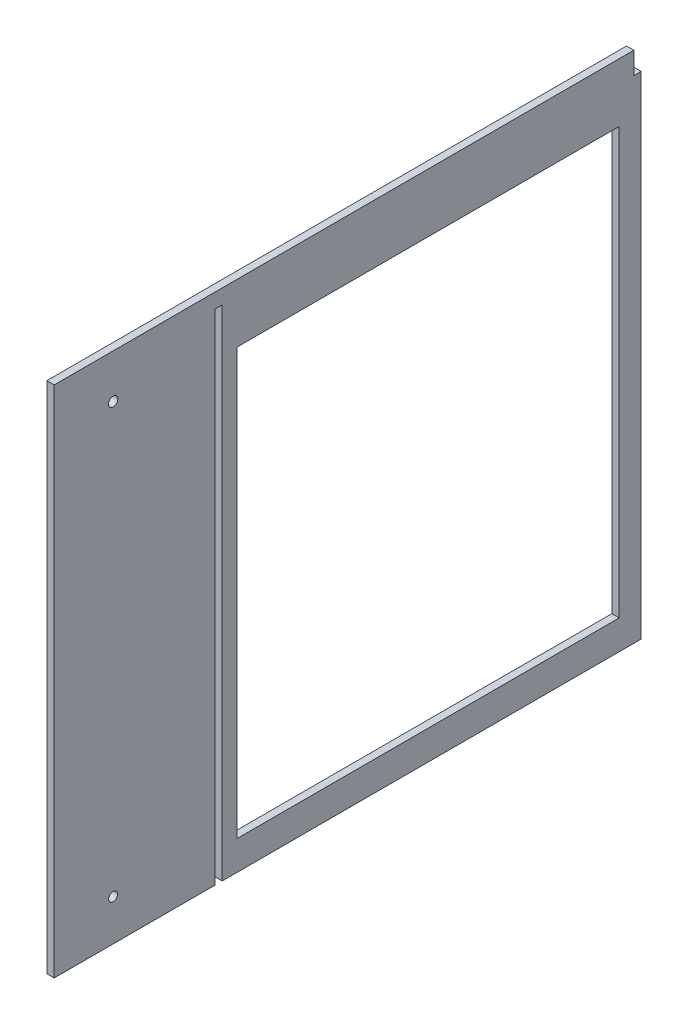
ISO-10303-21;
HEADER;
FILE_DESCRIPTION(('STEP AP214'),'2;1');
FILE_NAME('part.step','',(''),(''),'','','');
FILE_SCHEMA(('AUTOMOTIVE_DESIGN { 1 0 10303 214 1 1 1 1 }'));
ENDSEC;
DATA;
#1=APPLICATION_CONTEXT('core data for automotive mechanical design processes');
#2=APPLICATION_PROTOCOL_DEFINITION('international standard','automotive_design',2000,#1);
#3=PRODUCT_CONTEXT('',#1,'mechanical');
#4=PRODUCT('Part','Part','',(#3));
#5=PRODUCT_RELATED_PRODUCT_CATEGORY('part','',(#4));
#6=PRODUCT_DEFINITION_FORMATION('','',#4);
#7=PRODUCT_DEFINITION_CONTEXT('part definition',#1,'design');
#8=PRODUCT_DEFINITION('design','',#6,#7);
#9=PRODUCT_DEFINITION_SHAPE('','',#8);
#10=(LENGTH_UNIT() NAMED_UNIT(*) SI_UNIT(.MILLI.,.METRE.));
#11=(NAMED_UNIT(*) PLANE_ANGLE_UNIT() SI_UNIT($,.RADIAN.));
#12=(NAMED_UNIT(*) SI_UNIT($,.STERADIAN.) SOLID_ANGLE_UNIT());
#13=UNCERTAINTY_MEASURE_WITH_UNIT(LENGTH_MEASURE(1.E-05),#10,'distance_accuracy_value','');
#14=(GEOMETRIC_REPRESENTATION_CONTEXT(3) GLOBAL_UNCERTAINTY_ASSIGNED_CONTEXT((#13)) GLOBAL_UNIT_ASSIGNED_CONTEXT((#10,
#11,#12)) REPRESENTATION_CONTEXT('',''));
#15=CARTESIAN_POINT('',(0.,0.,0.));
#16=DIRECTION('',(0.,0.,1.));
#17=DIRECTION('',(1.,0.,0.));
#18=AXIS2_PLACEMENT_3D('',#15,#16,#17);
#19=CARTESIAN_POINT('',(-331.234660689463,-259.96015936255,-400.));
#20=DIRECTION('',(0.,-1.,0.));
#21=DIRECTION('',(0.,0.,-1.));
#22=AXIS2_PLACEMENT_3D('',#19,#20,#21);
#23=PLANE('',#22);
#24=DIRECTION('',(-1.,0.,0.));
#25=VECTOR('',#24,1.);
#26=CARTESIAN_POINT('',(-331.234660689463,-259.96015936255,-109.5));
#27=LINE('',#26,#25);
#28=CARTESIAN_POINT('',(-326.234660689463,-259.96015936255,-109.5));
#29=VERTEX_POINT('',#28);
#30=CARTESIAN_POINT('',(-331.234660689463,-259.96015936255,-109.5));
#31=VERTEX_POINT('',#30);
#32=EDGE_CURVE('E152',#29,#31,#27,.T.);
#33=ORIENTED_EDGE('',*,*,#32,.F.);
#34=DIRECTION('',(0.,0.,1.));
#35=VECTOR('',#34,1.);
#36=CARTESIAN_POINT('',(-326.234660689463,-259.96015936255,-400.));
#37=LINE('',#36,#35);
#38=CARTESIAN_POINT('',(-326.234660689463,-259.96015936255,0.));
#39=VERTEX_POINT('',#38);
#40=EDGE_CURVE('E224',#29,#39,#37,.T.);
#41=ORIENTED_EDGE('',*,*,#40,.T.);
#42=DIRECTION('',(1.,0.,0.));
#43=VECTOR('',#42,1.);
#44=CARTESIAN_POINT('',(-331.234660689463,-259.96015936255,0.));
#45=LINE('',#44,#43);
#46=CARTESIAN_POINT('',(-331.234660689463,-259.96015936255,0.));
#47=VERTEX_POINT('',#46);
#48=EDGE_CURVE('E208',#47,#39,#45,.T.);
#49=ORIENTED_EDGE('',*,*,#48,.F.);
#50=DIRECTION('',(0.,0.,1.));
#51=VECTOR('',#50,1.);
#52=CARTESIAN_POINT('',(-331.234660689463,-259.96015936255,-400.));
#53=LINE('',#52,#51);
#54=EDGE_CURVE('E205',#31,#47,#53,.T.);
#55=ORIENTED_EDGE('',*,*,#54,.F.);
#56=EDGE_LOOP('',(#33,#41,#49,#55));
#57=FACE_BOUND('',#56,.T.);
#58=ADVANCED_FACE('F32',(#57),#23,.T.);
#59=CARTESIAN_POINT('',(-331.234660689463,90.0398406374502,-400.));
#60=DIRECTION('',(-1.,0.,0.));
#61=DIRECTION('',(0.,0.,1.));
#62=AXIS2_PLACEMENT_3D('',#59,#60,#61);
#63=PLANE('',#62);
#64=CARTESIAN_POINT('',(-331.234660689463,60.1746951095763,-40.1848309699963));
#65=DIRECTION('',(-1.,0.,0.));
#66=DIRECTION('',(0.,0.,1.));
#67=AXIS2_PLACEMENT_3D('',#64,#65,#66);
#68=CIRCLE('',#67,3.175);
#69=CARTESIAN_POINT('',(-331.234660689463,60.1746951095763,-37.0098309699963));
#70=VERTEX_POINT('',#69);
#71=EDGE_CURVE('E242',#70,#70,#68,.T.);
#72=ORIENTED_EDGE('',*,*,#71,.F.);
#73=EDGE_LOOP('',(#72));
#74=FACE_BOUND('',#73,.T.);
#75=CARTESIAN_POINT('',(-331.234660689463,-232.01015936255,-40.1848309699963));
#76=DIRECTION('',(-1.,0.,0.));
#77=DIRECTION('',(0.,0.,1.));
#78=AXIS2_PLACEMENT_3D('',#75,#76,#77);
#79=CIRCLE('',#78,3.05);
#80=CARTESIAN_POINT('',(-331.234660689463,-232.01015936255,-37.1348309699963));
#81=VERTEX_POINT('',#80);
#82=EDGE_CURVE('E247',#81,#81,#79,.T.);
#83=ORIENTED_EDGE('',*,*,#82,.F.);
#84=EDGE_LOOP('',(#83));
#85=FACE_BOUND('',#84,.T.);
#86=DIRECTION('',(0.,1.,0.));
#87=VECTOR('',#86,1.);
#88=CARTESIAN_POINT('',(-331.234660689463,-259.96015936255,-109.5));
#89=LINE('',#88,#87);
#90=CARTESIAN_POINT('',(-331.234660689463,80.0398406374502,-109.5));
#91=VERTEX_POINT('',#90);
#92=EDGE_CURVE('E149',#31,#91,#89,.T.);
#93=ORIENTED_EDGE('',*,*,#92,.F.);
#94=ORIENTED_EDGE('',*,*,#54,.T.);
#95=DIRECTION('',(0.,-1.,0.));
#96=VECTOR('',#95,1.);
#97=CARTESIAN_POINT('',(-331.234660689463,90.0398406374502,0.));
#98=LINE('',#97,#96);
#99=CARTESIAN_POINT('',(-331.234660689463,90.0398406374502,0.));
#100=VERTEX_POINT('',#99);
#101=EDGE_CURVE('E195',#100,#47,#98,.T.);
#102=ORIENTED_EDGE('',*,*,#101,.F.);
#103=DIRECTION('',(0.,0.,1.));
#104=VECTOR('',#103,1.);
#105=CARTESIAN_POINT('',(-331.234660689463,90.0398406374502,-400.));
#106=LINE('',#105,#104);
#107=CARTESIAN_POINT('',(-331.234660689463,90.0398406374502,-395.));
#108=VERTEX_POINT('',#107);
#109=EDGE_CURVE('E216',#108,#100,#106,.T.);
#110=ORIENTED_EDGE('',*,*,#109,.F.);
#111=DIRECTION('',(0.,1.,0.));
#112=VECTOR('',#111,1.);
#113=CARTESIAN_POINT('',(-331.234660689463,90.0398406374502,-395.));
#114=LINE('',#113,#112);
#115=CARTESIAN_POINT('',(-331.234660689463,75.0398406374502,-395.));
#116=VERTEX_POINT('',#115);
#117=EDGE_CURVE('E184',#116,#108,#114,.T.);
#118=ORIENTED_EDGE('',*,*,#117,.F.);
#119=DIRECTION('',(0.,0.,1.));
#120=VECTOR('',#119,1.);
#121=CARTESIAN_POINT('',(-331.234660689463,75.0398406374502,-400.));
#122=LINE('',#121,#120);
#123=CARTESIAN_POINT('',(-331.234660689463,75.0398406374502,-400.));
#124=VERTEX_POINT('',#123);
#125=EDGE_CURVE('E181',#124,#116,#122,.T.);
#126=ORIENTED_EDGE('',*,*,#125,.F.);
#127=DIRECTION('',(0.,-1.,0.));
#128=VECTOR('',#127,1.);
#129=CARTESIAN_POINT('',(-331.234660689463,90.0398406374502,-400.));
#130=LINE('',#129,#128);
#131=CARTESIAN_POINT('',(-331.234660689463,-259.96015936255,-400.));
#132=VERTEX_POINT('',#131);
#133=EDGE_CURVE('E196',#124,#132,#130,.T.);
#134=ORIENTED_EDGE('',*,*,#133,.T.);
#135=CARTESIAN_POINT('',(-331.234660689463,-259.96015936255,-114.5));
#136=VERTEX_POINT('',#135);
#137=EDGE_CURVE('E225',#132,#136,#53,.T.);
#138=ORIENTED_EDGE('',*,*,#137,.T.);
#139=DIRECTION('',(0.,-1.,0.));
#140=VECTOR('',#139,1.);
#141=CARTESIAN_POINT('',(-331.234660689463,-259.96015936255,-114.5));
#142=LINE('',#141,#140);
#143=CARTESIAN_POINT('',(-331.234660689463,80.0398406374502,-114.5));
#144=VERTEX_POINT('',#143);
#145=EDGE_CURVE('E146',#144,#136,#142,.T.);
#146=ORIENTED_EDGE('',*,*,#145,.F.);
#147=DIRECTION('',(0.,0.,-1.));
#148=VECTOR('',#147,1.);
#149=CARTESIAN_POINT('',(-331.234660689463,80.0398406374502,-109.5));
#150=LINE('',#149,#148);
#151=EDGE_CURVE('E140',#91,#144,#150,.T.);
#152=ORIENTED_EDGE('',*,*,#151,.F.);
#153=EDGE_LOOP('',(#93,#94,#102,#110,#118,#126,#134,#138,#146,#152));
#154=FACE_BOUND('',#153,.T.);
#155=DIRECTION('',(0.,1.,0.));
#156=VECTOR('',#155,1.);
#157=CARTESIAN_POINT('',(-331.234660689463,-239.96015936255,-124.5));
#158=LINE('',#157,#156);
#159=CARTESIAN_POINT('',(-331.234660689463,-239.96015936255,-124.5));
#160=VERTEX_POINT('',#159);
#161=CARTESIAN_POINT('',(-331.234660689463,50.0398406374502,-124.5));
#162=VERTEX_POINT('',#161);
#163=EDGE_CURVE('E49',#160,#162,#158,.T.);
#164=ORIENTED_EDGE('',*,*,#163,.F.);
#165=DIRECTION('',(0.,0.,1.));
#166=VECTOR('',#165,1.);
#167=CARTESIAN_POINT('',(-331.234660689463,-239.96015936255,-124.5));
#168=LINE('',#167,#166);
#169=CARTESIAN_POINT('',(-331.234660689463,-239.96015936255,-385.));
#170=VERTEX_POINT('',#169);
#171=EDGE_CURVE('E172',#170,#160,#168,.T.);
#172=ORIENTED_EDGE('',*,*,#171,.F.);
#173=DIRECTION('',(0.,-1.,0.));
#174=VECTOR('',#173,1.);
#175=CARTESIAN_POINT('',(-331.234660689463,-239.96015936255,-385.));
#176=LINE('',#175,#174);
#177=CARTESIAN_POINT('',(-331.234660689463,50.0398406374501,-385.));
#178=VERTEX_POINT('',#177);
#179=EDGE_CURVE('E169',#178,#170,#176,.T.);
#180=ORIENTED_EDGE('',*,*,#179,.F.);
#181=DIRECTION('',(0.,0.,-1.));
#182=VECTOR('',#181,1.);
#183=CARTESIAN_POINT('',(-331.234660689463,50.0398406374502,-124.5));
#184=LINE('',#183,#182);
#185=EDGE_CURVE('E166',#162,#178,#184,.T.);
#186=ORIENTED_EDGE('',*,*,#185,.F.);
#187=EDGE_LOOP('',(#164,#172,#180,#186));
#188=FACE_BOUND('',#187,.T.);
#189=ADVANCED_FACE('F34',(#74,#85,#154,#188),#63,.T.);
#190=CARTESIAN_POINT('',(-331.234660689463,90.0398406374502,-400.));
#191=DIRECTION('',(0.,1.,0.));
#192=DIRECTION('',(0.,0.,1.));
#193=AXIS2_PLACEMENT_3D('',#190,#191,#192);
#194=PLANE('',#193);
#195=DIRECTION('',(-1.,0.,0.));
#196=VECTOR('',#195,1.);
#197=CARTESIAN_POINT('',(-301.234660689463,90.0398406374502,-395.));
#198=LINE('',#197,#196);
#199=CARTESIAN_POINT('',(-326.234660689463,90.0398406374502,-395.));
#200=VERTEX_POINT('',#199);
#201=EDGE_CURVE('E167',#200,#108,#198,.T.);
#202=ORIENTED_EDGE('',*,*,#201,.T.);
#203=ORIENTED_EDGE('',*,*,#109,.T.);
#204=DIRECTION('',(-1.,0.,0.));
#205=VECTOR('',#204,1.);
#206=CARTESIAN_POINT('',(-331.234660689463,90.0398406374502,0.));
#207=LINE('',#206,#205);
#208=CARTESIAN_POINT('',(-326.234660689463,90.0398406374502,0.));
#209=VERTEX_POINT('',#208);
#210=EDGE_CURVE('E199',#209,#100,#207,.T.);
#211=ORIENTED_EDGE('',*,*,#210,.F.);
#212=DIRECTION('',(0.,0.,1.));
#213=VECTOR('',#212,1.);
#214=CARTESIAN_POINT('',(-326.234660689463,90.0398406374502,-400.));
#215=LINE('',#214,#213);
#216=EDGE_CURVE('E219',#200,#209,#215,.T.);
#217=ORIENTED_EDGE('',*,*,#216,.F.);
#218=EDGE_LOOP('',(#202,#203,#211,#217));
#219=FACE_BOUND('',#218,.T.);
#220=ADVANCED_FACE('F257',(#219),#194,.T.);
#221=CARTESIAN_POINT('',(-326.234660689463,90.0398406374502,-400.));
#222=DIRECTION('',(1.,0.,0.));
#223=DIRECTION('',(0.,1.,0.));
#224=AXIS2_PLACEMENT_3D('',#221,#222,#223);
#225=PLANE('',#224);
#226=CARTESIAN_POINT('',(-326.234660689463,60.1746951095763,-40.1848309699963));
#227=DIRECTION('',(1.,0.,0.));
#228=DIRECTION('',(0.,1.,0.));
#229=AXIS2_PLACEMENT_3D('',#226,#227,#228);
#230=CIRCLE('',#229,3.175);
#231=CARTESIAN_POINT('',(-326.234660689463,63.3496951095763,-40.1848309699963));
#232=VERTEX_POINT('',#231);
#233=EDGE_CURVE('E36',#232,#232,#230,.T.);
#234=ORIENTED_EDGE('',*,*,#233,.F.);
#235=EDGE_LOOP('',(#234));
#236=FACE_BOUND('',#235,.T.);
#237=CARTESIAN_POINT('',(-326.234660689463,-232.01015936255,-40.1848309699963));
#238=DIRECTION('',(1.,0.,0.));
#239=DIRECTION('',(0.,1.,0.));
#240=AXIS2_PLACEMENT_3D('',#237,#238,#239);
#241=CIRCLE('',#240,3.05);
#242=CARTESIAN_POINT('',(-326.234660689463,-228.96015936255,-40.1848309699963));
#243=VERTEX_POINT('',#242);
#244=EDGE_CURVE('E240',#243,#243,#241,.T.);
#245=ORIENTED_EDGE('',*,*,#244,.F.);
#246=EDGE_LOOP('',(#245));
#247=FACE_BOUND('',#246,.T.);
#248=DIRECTION('',(0.,-1.,0.));
#249=VECTOR('',#248,1.);
#250=CARTESIAN_POINT('',(-326.234660689463,90.0398406374502,-109.5));
#251=LINE('',#250,#249);
#252=CARTESIAN_POINT('',(-326.234660689463,80.0398406374502,-109.5));
#253=VERTEX_POINT('',#252);
#254=EDGE_CURVE('E193',#253,#29,#251,.T.);
#255=ORIENTED_EDGE('',*,*,#254,.F.);
#256=DIRECTION('',(0.,0.,1.));
#257=VECTOR('',#256,1.);
#258=CARTESIAN_POINT('',(-326.234660689463,80.039840637451,-400.));
#259=LINE('',#258,#257);
#260=CARTESIAN_POINT('',(-326.234660689463,80.0398406374502,-114.5));
#261=VERTEX_POINT('',#260);
#262=EDGE_CURVE('E11',#261,#253,#259,.T.);
#263=ORIENTED_EDGE('',*,*,#262,.F.);
#264=DIRECTION('',(0.,1.,0.));
#265=VECTOR('',#264,1.);
#266=CARTESIAN_POINT('',(-326.234660689463,90.0398406374502,-114.5));
#267=LINE('',#266,#265);
#268=CARTESIAN_POINT('',(-326.234660689463,-259.96015936255,-114.5));
#269=VERTEX_POINT('',#268);
#270=EDGE_CURVE('E191',#269,#261,#267,.T.);
#271=ORIENTED_EDGE('',*,*,#270,.F.);
#272=CARTESIAN_POINT('',(-326.234660689463,-259.96015936255,-400.));
#273=VERTEX_POINT('',#272);
#274=EDGE_CURVE('E221',#273,#269,#37,.T.);
#275=ORIENTED_EDGE('',*,*,#274,.F.);
#276=DIRECTION('',(0.,1.,0.));
#277=VECTOR('',#276,1.);
#278=CARTESIAN_POINT('',(-326.234660689463,90.0398406374502,-400.));
#279=LINE('',#278,#277);
#280=CARTESIAN_POINT('',(-326.234660689463,75.0398406374502,-400.));
#281=VERTEX_POINT('',#280);
#282=EDGE_CURVE('E202',#273,#281,#279,.T.);
#283=ORIENTED_EDGE('',*,*,#282,.T.);
#284=DIRECTION('',(0.,0.,-1.));
#285=VECTOR('',#284,1.);
#286=CARTESIAN_POINT('',(-326.234660689463,75.0398406374502,-400.));
#287=LINE('',#286,#285);
#288=CARTESIAN_POINT('',(-326.234660689463,75.0398406374502,-395.));
#289=VERTEX_POINT('',#288);
#290=EDGE_CURVE('E163',#289,#281,#287,.T.);
#291=ORIENTED_EDGE('',*,*,#290,.F.);
#292=DIRECTION('',(0.,-1.,0.));
#293=VECTOR('',#292,1.);
#294=CARTESIAN_POINT('',(-326.234660689463,90.0398406374502,-395.));
#295=LINE('',#294,#293);
#296=EDGE_CURVE('E232',#200,#289,#295,.T.);
#297=ORIENTED_EDGE('',*,*,#296,.F.);
#298=ORIENTED_EDGE('',*,*,#216,.T.);
#299=DIRECTION('',(0.,1.,0.));
#300=VECTOR('',#299,1.);
#301=CARTESIAN_POINT('',(-326.234660689463,90.0398406374502,0.));
#302=LINE('',#301,#300);
#303=EDGE_CURVE('E211',#39,#209,#302,.T.);
#304=ORIENTED_EDGE('',*,*,#303,.F.);
#305=ORIENTED_EDGE('',*,*,#40,.F.);
#306=EDGE_LOOP('',(#255,#263,#271,#275,#283,#291,#297,#298,#304,#305));
#307=FACE_BOUND('',#306,.T.);
#308=DIRECTION('',(0.,-1.,0.));
#309=VECTOR('',#308,1.);
#310=CARTESIAN_POINT('',(-326.234660689463,90.0398406374502,-124.5));
#311=LINE('',#310,#309);
#312=CARTESIAN_POINT('',(-326.234660689463,50.0398406374502,-124.5));
#313=VERTEX_POINT('',#312);
#314=CARTESIAN_POINT('',(-326.234660689463,-239.96015936255,-124.5));
#315=VERTEX_POINT('',#314);
#316=EDGE_CURVE('E41',#313,#315,#311,.T.);
#317=ORIENTED_EDGE('',*,*,#316,.F.);
#318=DIRECTION('',(0.,0.,1.));
#319=VECTOR('',#318,1.);
#320=CARTESIAN_POINT('',(-326.234660689463,50.0398406374501,-400.));
#321=LINE('',#320,#319);
#322=CARTESIAN_POINT('',(-326.234660689463,50.0398406374501,-385.));
#323=VERTEX_POINT('',#322);
#324=EDGE_CURVE('E234',#323,#313,#321,.T.);
#325=ORIENTED_EDGE('',*,*,#324,.F.);
#326=DIRECTION('',(0.,1.,0.));
#327=VECTOR('',#326,1.);
#328=CARTESIAN_POINT('',(-326.234660689463,90.0398406374502,-385.));
#329=LINE('',#328,#327);
#330=CARTESIAN_POINT('',(-326.234660689463,-239.96015936255,-385.));
#331=VERTEX_POINT('',#330);
#332=EDGE_CURVE('E236',#331,#323,#329,.T.);
#333=ORIENTED_EDGE('',*,*,#332,.F.);
#334=DIRECTION('',(0.,0.,-1.));
#335=VECTOR('',#334,1.);
#336=CARTESIAN_POINT('',(-326.234660689463,-239.96015936255,-400.));
#337=LINE('',#336,#335);
#338=EDGE_CURVE('E238',#315,#331,#337,.T.);
#339=ORIENTED_EDGE('',*,*,#338,.F.);
#340=EDGE_LOOP('',(#317,#325,#333,#339));
#341=FACE_BOUND('',#340,.T.);
#342=ADVANCED_FACE('F263',(#236,#247,#307,#341),#225,.T.);
#343=DIRECTION('',(1.,0.,0.));
#344=VECTOR('',#343,1.);
#345=CARTESIAN_POINT('',(-331.234660689463,-259.96015936255,-114.5));
#346=LINE('',#345,#344);
#347=EDGE_CURVE('E229',#136,#269,#346,.T.);
#348=ORIENTED_EDGE('',*,*,#347,.F.);
#349=ORIENTED_EDGE('',*,*,#137,.F.);
#350=DIRECTION('',(1.,0.,0.));
#351=VECTOR('',#350,1.);
#352=CARTESIAN_POINT('',(-331.234660689463,-259.96015936255,-400.));
#353=LINE('',#352,#351);
#354=EDGE_CURVE('E198',#132,#273,#353,.T.);
#355=ORIENTED_EDGE('',*,*,#354,.T.);
#356=ORIENTED_EDGE('',*,*,#274,.T.);
#357=EDGE_LOOP('',(#348,#349,#355,#356));
#358=FACE_BOUND('',#357,.T.);
#359=ADVANCED_FACE('F267',(#358),#23,.T.);
#360=CARTESIAN_POINT('',(0.,0.,-400.));
#361=DIRECTION('',(0.,0.,1.));
#362=DIRECTION('',(1.,0.,0.));
#363=AXIS2_PLACEMENT_3D('',#360,#361,#362);
#364=PLANE('',#363);
#365=ORIENTED_EDGE('',*,*,#133,.F.);
#366=DIRECTION('',(1.,0.,0.));
#367=VECTOR('',#366,1.);
#368=CARTESIAN_POINT('',(0.,75.0398406374502,-400.));
#369=LINE('',#368,#367);
#370=EDGE_CURVE('E218',#124,#281,#369,.T.);
#371=ORIENTED_EDGE('',*,*,#370,.T.);
#372=ORIENTED_EDGE('',*,*,#282,.F.);
#373=ORIENTED_EDGE('',*,*,#354,.F.);
#374=EDGE_LOOP('',(#365,#371,#372,#373));
#375=FACE_BOUND('',#374,.T.);
#376=ADVANCED_FACE('F272',(#375),#364,.F.);
#377=CARTESIAN_POINT('',(0.,0.,0.));
#378=DIRECTION('',(0.,0.,1.));
#379=DIRECTION('',(1.,0.,0.));
#380=AXIS2_PLACEMENT_3D('',#377,#378,#379);
#381=PLANE('',#380);
#382=ORIENTED_EDGE('',*,*,#101,.T.);
#383=ORIENTED_EDGE('',*,*,#48,.T.);
#384=ORIENTED_EDGE('',*,*,#303,.T.);
#385=ORIENTED_EDGE('',*,*,#210,.T.);
#386=EDGE_LOOP('',(#382,#383,#384,#385));
#387=FACE_BOUND('',#386,.T.);
#388=ADVANCED_FACE('F278',(#387),#381,.T.);
#389=CARTESIAN_POINT('',(-301.234660689463,90.0398406374502,-395.));
#390=DIRECTION('',(0.,0.,1.));
#391=DIRECTION('',(1.,0.,0.));
#392=AXIS2_PLACEMENT_3D('',#389,#390,#391);
#393=PLANE('',#392);
#394=ORIENTED_EDGE('',*,*,#296,.T.);
#395=DIRECTION('',(-1.,0.,0.));
#396=VECTOR('',#395,1.);
#397=CARTESIAN_POINT('',(-301.234660689463,75.0398406374502,-395.));
#398=LINE('',#397,#396);
#399=EDGE_CURVE('E186',#289,#116,#398,.T.);
#400=ORIENTED_EDGE('',*,*,#399,.T.);
#401=ORIENTED_EDGE('',*,*,#117,.T.);
#402=ORIENTED_EDGE('',*,*,#201,.F.);
#403=EDGE_LOOP('',(#394,#400,#401,#402));
#404=FACE_BOUND('',#403,.T.);
#405=ADVANCED_FACE('F322',(#404),#393,.F.);
#406=CARTESIAN_POINT('',(-301.234660689463,75.0398406374502,-400.));
#407=DIRECTION('',(0.,-1.,0.));
#408=DIRECTION('',(0.,0.,-1.));
#409=AXIS2_PLACEMENT_3D('',#406,#407,#408);
#410=PLANE('',#409);
#411=ORIENTED_EDGE('',*,*,#290,.T.);
#412=ORIENTED_EDGE('',*,*,#370,.F.);
#413=ORIENTED_EDGE('',*,*,#125,.T.);
#414=ORIENTED_EDGE('',*,*,#399,.F.);
#415=EDGE_LOOP('',(#411,#412,#413,#414));
#416=FACE_BOUND('',#415,.T.);
#417=ADVANCED_FACE('F304',(#416),#410,.F.);
#418=CARTESIAN_POINT('',(-301.234660689463,-259.96015936255,-109.5));
#419=DIRECTION('',(0.,0.,1.));
#420=DIRECTION('',(1.,0.,0.));
#421=AXIS2_PLACEMENT_3D('',#418,#419,#420);
#422=PLANE('',#421);
#423=ORIENTED_EDGE('',*,*,#254,.T.);
#424=ORIENTED_EDGE('',*,*,#32,.T.);
#425=ORIENTED_EDGE('',*,*,#92,.T.);
#426=DIRECTION('',(-1.,0.,0.));
#427=VECTOR('',#426,1.);
#428=CARTESIAN_POINT('',(-301.234660689463,80.0398406374502,-109.5));
#429=LINE('',#428,#427);
#430=EDGE_CURVE('E135',#253,#91,#429,.T.);
#431=ORIENTED_EDGE('',*,*,#430,.F.);
#432=EDGE_LOOP('',(#423,#424,#425,#431));
#433=FACE_BOUND('',#432,.T.);
#434=ADVANCED_FACE('F150',(#433),#422,.F.);
#435=CARTESIAN_POINT('',(-301.234660689463,-259.96015936255,-114.5));
#436=DIRECTION('',(0.,0.,-1.));
#437=DIRECTION('',(-1.,0.,0.));
#438=AXIS2_PLACEMENT_3D('',#435,#436,#437);
#439=PLANE('',#438);
#440=ORIENTED_EDGE('',*,*,#270,.T.);
#441=DIRECTION('',(-1.,0.,0.));
#442=VECTOR('',#441,1.);
#443=CARTESIAN_POINT('',(-301.234660689463,80.0398406374502,-114.5));
#444=LINE('',#443,#442);
#445=EDGE_CURVE('E145',#261,#144,#444,.T.);
#446=ORIENTED_EDGE('',*,*,#445,.T.);
#447=ORIENTED_EDGE('',*,*,#145,.T.);
#448=ORIENTED_EDGE('',*,*,#347,.T.);
#449=EDGE_LOOP('',(#440,#446,#447,#448));
#450=FACE_BOUND('',#449,.T.);
#451=ADVANCED_FACE('F295',(#450),#439,.F.);
#452=CARTESIAN_POINT('',(-301.234660689463,80.0398406374502,-109.5));
#453=DIRECTION('',(0.,1.,0.));
#454=DIRECTION('',(0.,0.,1.));
#455=AXIS2_PLACEMENT_3D('',#452,#453,#454);
#456=PLANE('',#455);
#457=ORIENTED_EDGE('',*,*,#262,.T.);
#458=ORIENTED_EDGE('',*,*,#430,.T.);
#459=ORIENTED_EDGE('',*,*,#151,.T.);
#460=ORIENTED_EDGE('',*,*,#445,.F.);
#461=EDGE_LOOP('',(#457,#458,#459,#460));
#462=FACE_BOUND('',#461,.T.);
#463=ADVANCED_FACE('F137',(#462),#456,.F.);
#464=CARTESIAN_POINT('',(-301.234660689463,-239.96015936255,-124.5));
#465=DIRECTION('',(0.,0.,1.));
#466=DIRECTION('',(0.,-1.,0.));
#467=AXIS2_PLACEMENT_3D('',#464,#465,#466);
#468=PLANE('',#467);
#469=ORIENTED_EDGE('',*,*,#316,.T.);
#470=DIRECTION('',(-1.,0.,0.));
#471=VECTOR('',#470,1.);
#472=CARTESIAN_POINT('',(-301.234660689463,-239.96015936255,-124.5));
#473=LINE('',#472,#471);
#474=EDGE_CURVE('E155',#315,#160,#473,.T.);
#475=ORIENTED_EDGE('',*,*,#474,.T.);
#476=ORIENTED_EDGE('',*,*,#163,.T.);
#477=DIRECTION('',(-1.,0.,0.));
#478=VECTOR('',#477,1.);
#479=CARTESIAN_POINT('',(-301.234660689463,50.0398406374502,-124.5));
#480=LINE('',#479,#478);
#481=EDGE_CURVE('E175',#313,#162,#480,.T.);
#482=ORIENTED_EDGE('',*,*,#481,.F.);
#483=EDGE_LOOP('',(#469,#475,#476,#482));
#484=FACE_BOUND('',#483,.T.);
#485=ADVANCED_FACE('F302',(#484),#468,.F.);
#486=CARTESIAN_POINT('',(-301.234660689463,-239.96015936255,-124.5));
#487=DIRECTION('',(0.,-1.,0.));
#488=DIRECTION('',(0.,0.,-1.));
#489=AXIS2_PLACEMENT_3D('',#486,#487,#488);
#490=PLANE('',#489);
#491=ORIENTED_EDGE('',*,*,#338,.T.);
#492=DIRECTION('',(-1.,0.,0.));
#493=VECTOR('',#492,1.);
#494=CARTESIAN_POINT('',(-301.234660689463,-239.96015936255,-385.));
#495=LINE('',#494,#493);
#496=EDGE_CURVE('E177',#331,#170,#495,.T.);
#497=ORIENTED_EDGE('',*,*,#496,.T.);
#498=ORIENTED_EDGE('',*,*,#171,.T.);
#499=ORIENTED_EDGE('',*,*,#474,.F.);
#500=EDGE_LOOP('',(#491,#497,#498,#499));
#501=FACE_BOUND('',#500,.T.);
#502=ADVANCED_FACE('F309',(#501),#490,.F.);
#503=CARTESIAN_POINT('',(-301.234660689463,-239.96015936255,-385.));
#504=DIRECTION('',(0.,0.,-1.));
#505=DIRECTION('',(-1.,0.,0.));
#506=AXIS2_PLACEMENT_3D('',#503,#504,#505);
#507=PLANE('',#506);
#508=ORIENTED_EDGE('',*,*,#332,.T.);
#509=DIRECTION('',(-1.,0.,0.));
#510=VECTOR('',#509,1.);
#511=CARTESIAN_POINT('',(-301.234660689463,50.0398406374501,-385.));
#512=LINE('',#511,#510);
#513=EDGE_CURVE('E57',#323,#178,#512,.T.);
#514=ORIENTED_EDGE('',*,*,#513,.T.);
#515=ORIENTED_EDGE('',*,*,#179,.T.);
#516=ORIENTED_EDGE('',*,*,#496,.F.);
#517=EDGE_LOOP('',(#508,#514,#515,#516));
#518=FACE_BOUND('',#517,.T.);
#519=ADVANCED_FACE('F312',(#518),#507,.F.);
#520=CARTESIAN_POINT('',(-301.234660689463,50.0398406374502,-124.5));
#521=DIRECTION('',(0.,1.,0.));
#522=DIRECTION('',(0.,0.,1.));
#523=AXIS2_PLACEMENT_3D('',#520,#521,#522);
#524=PLANE('',#523);
#525=ORIENTED_EDGE('',*,*,#324,.T.);
#526=ORIENTED_EDGE('',*,*,#481,.T.);
#527=ORIENTED_EDGE('',*,*,#185,.T.);
#528=ORIENTED_EDGE('',*,*,#513,.F.);
#529=EDGE_LOOP('',(#525,#526,#527,#528));
#530=FACE_BOUND('',#529,.T.);
#531=ADVANCED_FACE('F316',(#530),#524,.F.);
#532=CARTESIAN_POINT('',(-321.234660689463,-232.01015936255,-40.1848309699963));
#533=DIRECTION('',(-1.,0.,0.));
#534=DIRECTION('',(0.,0.,1.));
#535=AXIS2_PLACEMENT_3D('',#532,#533,#534);
#536=CYLINDRICAL_SURFACE('',#535,3.05);
#537=ORIENTED_EDGE('',*,*,#244,.T.);
#538=EDGE_LOOP('',(#537));
#539=FACE_BOUND('',#538,.T.);
#540=ORIENTED_EDGE('',*,*,#82,.T.);
#541=EDGE_LOOP('',(#540));
#542=FACE_BOUND('',#541,.T.);
#543=ADVANCED_FACE('F254',(#539,#542),#536,.F.);
#544=CARTESIAN_POINT('',(-321.234660689463,60.1746951095763,-40.1848309699963));
#545=DIRECTION('',(-1.,0.,0.));
#546=DIRECTION('',(0.,0.,1.));
#547=AXIS2_PLACEMENT_3D('',#544,#545,#546);
#548=CYLINDRICAL_SURFACE('',#547,3.175);
#549=ORIENTED_EDGE('',*,*,#233,.T.);
#550=EDGE_LOOP('',(#549));
#551=FACE_BOUND('',#550,.T.);
#552=ORIENTED_EDGE('',*,*,#71,.T.);
#553=EDGE_LOOP('',(#552));
#554=FACE_BOUND('',#553,.T.);
#555=ADVANCED_FACE('F410',(#551,#554),#548,.F.);
#556=CLOSED_SHELL('',(#58,#189,#220,#342,#359,#376,#388,#405,#417,#434,#451,#463,#485,#502,#519,
#531,#543,#555));
#557=MANIFOLD_SOLID_BREP('B2',#556);
#558=ADVANCED_BREP_SHAPE_REPRESENTATION('',(#18,#557),#14);
#559=SHAPE_DEFINITION_REPRESENTATION(#9,#558);
ENDSEC;
END-ISO-10303-21;
